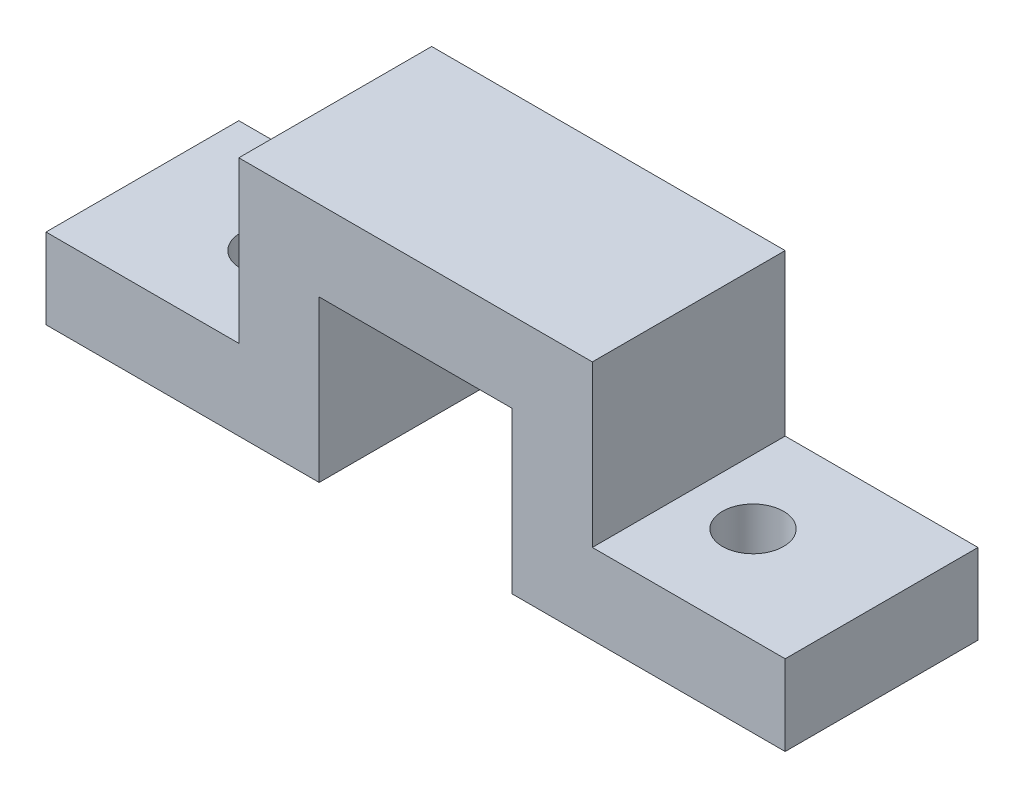
ISO-10303-21;
HEADER;
FILE_DESCRIPTION(('STEP AP214'),'2;1');
FILE_NAME('part.step','',(''),(''),'','','');
FILE_SCHEMA(('AUTOMOTIVE_DESIGN { 1 0 10303 214 1 1 1 1 }'));
ENDSEC;
DATA;
#1=APPLICATION_CONTEXT('core data for automotive mechanical design processes');
#2=APPLICATION_PROTOCOL_DEFINITION('international standard','automotive_design',2000,#1);
#3=PRODUCT_CONTEXT('',#1,'mechanical');
#4=PRODUCT('Part','Part','',(#3));
#5=PRODUCT_RELATED_PRODUCT_CATEGORY('part','',(#4));
#6=PRODUCT_DEFINITION_FORMATION('','',#4);
#7=PRODUCT_DEFINITION_CONTEXT('part definition',#1,'design');
#8=PRODUCT_DEFINITION('design','',#6,#7);
#9=PRODUCT_DEFINITION_SHAPE('','',#8);
#10=(LENGTH_UNIT() NAMED_UNIT(*) SI_UNIT(.MILLI.,.METRE.));
#11=(NAMED_UNIT(*) PLANE_ANGLE_UNIT() SI_UNIT($,.RADIAN.));
#12=(NAMED_UNIT(*) SI_UNIT($,.STERADIAN.) SOLID_ANGLE_UNIT());
#13=UNCERTAINTY_MEASURE_WITH_UNIT(LENGTH_MEASURE(1.E-05),#10,'distance_accuracy_value','');
#14=(GEOMETRIC_REPRESENTATION_CONTEXT(3) GLOBAL_UNCERTAINTY_ASSIGNED_CONTEXT((#13)) GLOBAL_UNIT_ASSIGNED_CONTEXT((#10,
#11,#12)) REPRESENTATION_CONTEXT('',''));
#15=CARTESIAN_POINT('',(0.,0.,0.));
#16=DIRECTION('',(0.,0.,1.));
#17=DIRECTION('',(1.,0.,0.));
#18=AXIS2_PLACEMENT_3D('',#15,#16,#17);
#19=CARTESIAN_POINT('',(-11.,5.,12.));
#20=DIRECTION('',(0.,-1.,0.));
#21=DIRECTION('',(1.,0.,0.));
#22=AXIS2_PLACEMENT_3D('',#19,#20,#21);
#23=PLANE('',#22);
#24=DIRECTION('',(-1.,0.,0.));
#25=VECTOR('',#24,1.);
#26=CARTESIAN_POINT('',(-11.,5.,0.));
#27=LINE('',#26,#25);
#28=CARTESIAN_POINT('',(-11.,5.,0.));
#29=VERTEX_POINT('',#28);
#30=CARTESIAN_POINT('',(-23.,5.,0.));
#31=VERTEX_POINT('',#30);
#32=EDGE_CURVE('E162',#29,#31,#27,.T.);
#33=ORIENTED_EDGE('',*,*,#32,.T.);
#34=DIRECTION('',(0.,0.,-1.));
#35=VECTOR('',#34,1.);
#36=CARTESIAN_POINT('',(-23.,5.,12.));
#37=LINE('',#36,#35);
#38=CARTESIAN_POINT('',(-23.,5.,12.));
#39=VERTEX_POINT('',#38);
#40=EDGE_CURVE('E193',#39,#31,#37,.T.);
#41=ORIENTED_EDGE('',*,*,#40,.F.);
#42=DIRECTION('',(-1.,0.,0.));
#43=VECTOR('',#42,1.);
#44=CARTESIAN_POINT('',(-11.,5.,12.));
#45=LINE('',#44,#43);
#46=CARTESIAN_POINT('',(-11.,5.,12.));
#47=VERTEX_POINT('',#46);
#48=EDGE_CURVE('E223',#47,#39,#45,.T.);
#49=ORIENTED_EDGE('',*,*,#48,.F.);
#50=DIRECTION('',(0.,0.,-1.));
#51=VECTOR('',#50,1.);
#52=CARTESIAN_POINT('',(-11.,5.,12.));
#53=LINE('',#52,#51);
#54=EDGE_CURVE('E196',#47,#29,#53,.T.);
#55=ORIENTED_EDGE('',*,*,#54,.T.);
#56=EDGE_LOOP('',(#33,#41,#49,#55));
#57=FACE_BOUND('',#56,.T.);
#58=CARTESIAN_POINT('',(-15.,5.,6.00000000000001));
#59=DIRECTION('',(0.,-1.,0.));
#60=DIRECTION('',(1.,0.,0.));
#61=AXIS2_PLACEMENT_3D('',#58,#59,#60);
#62=CIRCLE('',#61,1.9);
#63=CARTESIAN_POINT('',(-13.1,5.,6.00000000000001));
#64=VERTEX_POINT('',#63);
#65=EDGE_CURVE('E158',#64,#64,#62,.F.);
#66=ORIENTED_EDGE('',*,*,#65,.F.);
#67=EDGE_LOOP('',(#66));
#68=FACE_BOUND('',#67,.T.);
#69=ADVANCED_FACE('F32',(#57,#68),#23,.F.);
#70=CARTESIAN_POINT('',(-23.,0.,12.));
#71=DIRECTION('',(0.,1.,0.));
#72=DIRECTION('',(-1.,0.,0.));
#73=AXIS2_PLACEMENT_3D('',#70,#71,#72);
#74=PLANE('',#73);
#75=DIRECTION('',(1.,0.,0.));
#76=VECTOR('',#75,1.);
#77=CARTESIAN_POINT('',(-23.,0.,0.));
#78=LINE('',#77,#76);
#79=CARTESIAN_POINT('',(-23.,0.,0.));
#80=VERTEX_POINT('',#79);
#81=CARTESIAN_POINT('',(-6.,0.,0.));
#82=VERTEX_POINT('',#81);
#83=EDGE_CURVE('E166',#80,#82,#78,.T.);
#84=ORIENTED_EDGE('',*,*,#83,.T.);
#85=DIRECTION('',(0.,0.,-1.));
#86=VECTOR('',#85,1.);
#87=CARTESIAN_POINT('',(-6.,0.,12.));
#88=LINE('',#87,#86);
#89=CARTESIAN_POINT('',(-6.,0.,12.));
#90=VERTEX_POINT('',#89);
#91=EDGE_CURVE('E187',#90,#82,#88,.T.);
#92=ORIENTED_EDGE('',*,*,#91,.F.);
#93=DIRECTION('',(1.,0.,0.));
#94=VECTOR('',#93,1.);
#95=CARTESIAN_POINT('',(-23.,0.,12.));
#96=LINE('',#95,#94);
#97=CARTESIAN_POINT('',(-23.,0.,12.));
#98=VERTEX_POINT('',#97);
#99=EDGE_CURVE('E222',#98,#90,#96,.T.);
#100=ORIENTED_EDGE('',*,*,#99,.F.);
#101=DIRECTION('',(0.,0.,-1.));
#102=VECTOR('',#101,1.);
#103=CARTESIAN_POINT('',(-23.,0.,12.));
#104=LINE('',#103,#102);
#105=EDGE_CURVE('E190',#98,#80,#104,.T.);
#106=ORIENTED_EDGE('',*,*,#105,.T.);
#107=EDGE_LOOP('',(#84,#92,#100,#106));
#108=FACE_BOUND('',#107,.T.);
#109=CARTESIAN_POINT('',(-15.,0.,6.00000000000001));
#110=DIRECTION('',(0.,1.,0.));
#111=DIRECTION('',(0.,0.,1.));
#112=AXIS2_PLACEMENT_3D('',#109,#110,#111);
#113=CIRCLE('',#112,1.9);
#114=CARTESIAN_POINT('',(-15.,0.,7.90000000000001));
#115=VERTEX_POINT('',#114);
#116=EDGE_CURVE('E387',#115,#115,#113,.T.);
#117=ORIENTED_EDGE('',*,*,#116,.T.);
#118=EDGE_LOOP('',(#117));
#119=FACE_BOUND('',#118,.T.);
#120=ADVANCED_FACE('F258',(#108,#119),#74,.F.);
#121=CARTESIAN_POINT('',(11.,15.,12.));
#122=DIRECTION('',(-1.,0.,0.));
#123=DIRECTION('',(0.,-1.,0.));
#124=AXIS2_PLACEMENT_3D('',#121,#122,#123);
#125=PLANE('',#124);
#126=DIRECTION('',(0.,1.,0.));
#127=VECTOR('',#126,1.);
#128=CARTESIAN_POINT('',(11.,15.,0.));
#129=LINE('',#128,#127);
#130=CARTESIAN_POINT('',(11.,5.,0.));
#131=VERTEX_POINT('',#130);
#132=CARTESIAN_POINT('',(11.,15.,0.));
#133=VERTEX_POINT('',#132);
#134=EDGE_CURVE('E154',#131,#133,#129,.T.);
#135=ORIENTED_EDGE('',*,*,#134,.T.);
#136=DIRECTION('',(0.,0.,-1.));
#137=VECTOR('',#136,1.);
#138=CARTESIAN_POINT('',(11.,15.,12.));
#139=LINE('',#138,#137);
#140=CARTESIAN_POINT('',(11.,15.,12.));
#141=VERTEX_POINT('',#140);
#142=EDGE_CURVE('E11',#141,#133,#139,.T.);
#143=ORIENTED_EDGE('',*,*,#142,.F.);
#144=DIRECTION('',(0.,1.,0.));
#145=VECTOR('',#144,1.);
#146=CARTESIAN_POINT('',(11.,15.,12.));
#147=LINE('',#146,#145);
#148=CARTESIAN_POINT('',(11.,5.,12.));
#149=VERTEX_POINT('',#148);
#150=EDGE_CURVE('E177',#149,#141,#147,.T.);
#151=ORIENTED_EDGE('',*,*,#150,.F.);
#152=DIRECTION('',(0.,0.,-1.));
#153=VECTOR('',#152,1.);
#154=CARTESIAN_POINT('',(11.,5.,12.));
#155=LINE('',#154,#153);
#156=EDGE_CURVE('E150',#149,#131,#155,.T.);
#157=ORIENTED_EDGE('',*,*,#156,.T.);
#158=EDGE_LOOP('',(#135,#143,#151,#157));
#159=FACE_BOUND('',#158,.T.);
#160=ADVANCED_FACE('F34',(#159),#125,.F.);
#161=CARTESIAN_POINT('',(-11.,15.,12.));
#162=DIRECTION('',(0.,-1.,0.));
#163=DIRECTION('',(0.,0.,-1.));
#164=AXIS2_PLACEMENT_3D('',#161,#162,#163);
#165=PLANE('',#164);
#166=DIRECTION('',(-1.,0.,0.));
#167=VECTOR('',#166,1.);
#168=CARTESIAN_POINT('',(-11.,15.,0.));
#169=LINE('',#168,#167);
#170=CARTESIAN_POINT('',(-11.,15.,0.));
#171=VERTEX_POINT('',#170);
#172=EDGE_CURVE('E157',#133,#171,#169,.T.);
#173=ORIENTED_EDGE('',*,*,#172,.T.);
#174=DIRECTION('',(0.,0.,-1.));
#175=VECTOR('',#174,1.);
#176=CARTESIAN_POINT('',(-11.,15.,12.));
#177=LINE('',#176,#175);
#178=CARTESIAN_POINT('',(-11.,15.,12.));
#179=VERTEX_POINT('',#178);
#180=EDGE_CURVE('E42',#179,#171,#177,.T.);
#181=ORIENTED_EDGE('',*,*,#180,.F.);
#182=DIRECTION('',(-1.,0.,0.));
#183=VECTOR('',#182,1.);
#184=CARTESIAN_POINT('',(-11.,15.,12.));
#185=LINE('',#184,#183);
#186=EDGE_CURVE('E105',#141,#179,#185,.T.);
#187=ORIENTED_EDGE('',*,*,#186,.F.);
#188=ORIENTED_EDGE('',*,*,#142,.T.);
#189=EDGE_LOOP('',(#173,#181,#187,#188));
#190=FACE_BOUND('',#189,.T.);
#191=ADVANCED_FACE('F268',(#190),#165,.F.);
#192=CARTESIAN_POINT('',(-11.,15.,12.));
#193=DIRECTION('',(1.,0.,0.));
#194=DIRECTION('',(0.,1.,0.));
#195=AXIS2_PLACEMENT_3D('',#192,#193,#194);
#196=PLANE('',#195);
#197=DIRECTION('',(0.,-1.,0.));
#198=VECTOR('',#197,1.);
#199=CARTESIAN_POINT('',(-11.,15.,0.));
#200=LINE('',#199,#198);
#201=EDGE_CURVE('E160',#171,#29,#200,.T.);
#202=ORIENTED_EDGE('',*,*,#201,.T.);
#203=ORIENTED_EDGE('',*,*,#54,.F.);
#204=DIRECTION('',(0.,-1.,0.));
#205=VECTOR('',#204,1.);
#206=CARTESIAN_POINT('',(-11.,15.,12.));
#207=LINE('',#206,#205);
#208=EDGE_CURVE('E205',#179,#47,#207,.T.);
#209=ORIENTED_EDGE('',*,*,#208,.F.);
#210=ORIENTED_EDGE('',*,*,#180,.T.);
#211=EDGE_LOOP('',(#202,#203,#209,#210));
#212=FACE_BOUND('',#211,.T.);
#213=ADVANCED_FACE('F203',(#212),#196,.F.);
#214=CARTESIAN_POINT('',(-23.,5.,12.));
#215=DIRECTION('',(1.,0.,0.));
#216=DIRECTION('',(0.,0.,-1.));
#217=AXIS2_PLACEMENT_3D('',#214,#215,#216);
#218=PLANE('',#217);
#219=DIRECTION('',(0.,-1.,0.));
#220=VECTOR('',#219,1.);
#221=CARTESIAN_POINT('',(-23.,5.,0.));
#222=LINE('',#221,#220);
#223=EDGE_CURVE('E164',#31,#80,#222,.T.);
#224=ORIENTED_EDGE('',*,*,#223,.T.);
#225=ORIENTED_EDGE('',*,*,#105,.F.);
#226=DIRECTION('',(0.,-1.,0.));
#227=VECTOR('',#226,1.);
#228=CARTESIAN_POINT('',(-23.,5.,12.));
#229=LINE('',#228,#227);
#230=EDGE_CURVE('E220',#39,#98,#229,.T.);
#231=ORIENTED_EDGE('',*,*,#230,.F.);
#232=ORIENTED_EDGE('',*,*,#40,.T.);
#233=EDGE_LOOP('',(#224,#225,#231,#232));
#234=FACE_BOUND('',#233,.T.);
#235=ADVANCED_FACE('F218',(#234),#218,.F.);
#236=CARTESIAN_POINT('',(-6.,0.,12.));
#237=DIRECTION('',(-1.,0.,0.));
#238=DIRECTION('',(0.,-1.,0.));
#239=AXIS2_PLACEMENT_3D('',#236,#237,#238);
#240=PLANE('',#239);
#241=DIRECTION('',(0.,1.,0.));
#242=VECTOR('',#241,1.);
#243=CARTESIAN_POINT('',(-6.,0.,0.));
#244=LINE('',#243,#242);
#245=CARTESIAN_POINT('',(-6.,10.,0.));
#246=VERTEX_POINT('',#245);
#247=EDGE_CURVE('E168',#82,#246,#244,.T.);
#248=ORIENTED_EDGE('',*,*,#247,.T.);
#249=DIRECTION('',(0.,0.,-1.));
#250=VECTOR('',#249,1.);
#251=CARTESIAN_POINT('',(-6.,10.,12.));
#252=LINE('',#251,#250);
#253=CARTESIAN_POINT('',(-6.,10.,12.));
#254=VERTEX_POINT('',#253);
#255=EDGE_CURVE('E184',#254,#246,#252,.T.);
#256=ORIENTED_EDGE('',*,*,#255,.F.);
#257=DIRECTION('',(0.,1.,0.));
#258=VECTOR('',#257,1.);
#259=CARTESIAN_POINT('',(-6.,0.,12.));
#260=LINE('',#259,#258);
#261=EDGE_CURVE('E225',#90,#254,#260,.T.);
#262=ORIENTED_EDGE('',*,*,#261,.F.);
#263=ORIENTED_EDGE('',*,*,#91,.T.);
#264=EDGE_LOOP('',(#248,#256,#262,#263));
#265=FACE_BOUND('',#264,.T.);
#266=ADVANCED_FACE('F350',(#265),#240,.F.);
#267=CARTESIAN_POINT('',(6.,10.,12.));
#268=DIRECTION('',(0.,1.,0.));
#269=DIRECTION('',(0.,0.,1.));
#270=AXIS2_PLACEMENT_3D('',#267,#268,#269);
#271=PLANE('',#270);
#272=DIRECTION('',(1.,0.,0.));
#273=VECTOR('',#272,1.);
#274=CARTESIAN_POINT('',(6.,10.,0.));
#275=LINE('',#274,#273);
#276=CARTESIAN_POINT('',(6.,10.,0.));
#277=VERTEX_POINT('',#276);
#278=EDGE_CURVE('E170',#246,#277,#275,.T.);
#279=ORIENTED_EDGE('',*,*,#278,.T.);
#280=DIRECTION('',(0.,0.,-1.));
#281=VECTOR('',#280,1.);
#282=CARTESIAN_POINT('',(6.,10.,12.));
#283=LINE('',#282,#281);
#284=CARTESIAN_POINT('',(6.,10.,12.));
#285=VERTEX_POINT('',#284);
#286=EDGE_CURVE('E181',#285,#277,#283,.T.);
#287=ORIENTED_EDGE('',*,*,#286,.F.);
#288=DIRECTION('',(1.,0.,0.));
#289=VECTOR('',#288,1.);
#290=CARTESIAN_POINT('',(6.,10.,12.));
#291=LINE('',#290,#289);
#292=EDGE_CURVE('E231',#254,#285,#291,.T.);
#293=ORIENTED_EDGE('',*,*,#292,.F.);
#294=ORIENTED_EDGE('',*,*,#255,.T.);
#295=EDGE_LOOP('',(#279,#287,#293,#294));
#296=FACE_BOUND('',#295,.T.);
#297=ADVANCED_FACE('F237',(#296),#271,.F.);
#298=CARTESIAN_POINT('',(6.,0.,12.));
#299=DIRECTION('',(1.,0.,0.));
#300=DIRECTION('',(0.,1.,0.));
#301=AXIS2_PLACEMENT_3D('',#298,#299,#300);
#302=PLANE('',#301);
#303=DIRECTION('',(0.,-1.,0.));
#304=VECTOR('',#303,1.);
#305=CARTESIAN_POINT('',(6.,0.,0.));
#306=LINE('',#305,#304);
#307=CARTESIAN_POINT('',(6.,0.,0.));
#308=VERTEX_POINT('',#307);
#309=EDGE_CURVE('E172',#277,#308,#306,.T.);
#310=ORIENTED_EDGE('',*,*,#309,.T.);
#311=DIRECTION('',(0.,0.,-1.));
#312=VECTOR('',#311,1.);
#313=CARTESIAN_POINT('',(6.,0.,12.));
#314=LINE('',#313,#312);
#315=CARTESIAN_POINT('',(6.,0.,12.));
#316=VERTEX_POINT('',#315);
#317=EDGE_CURVE('E145',#316,#308,#314,.T.);
#318=ORIENTED_EDGE('',*,*,#317,.F.);
#319=DIRECTION('',(0.,-1.,0.));
#320=VECTOR('',#319,1.);
#321=CARTESIAN_POINT('',(6.,0.,12.));
#322=LINE('',#321,#320);
#323=EDGE_CURVE('E136',#285,#316,#322,.T.);
#324=ORIENTED_EDGE('',*,*,#323,.F.);
#325=ORIENTED_EDGE('',*,*,#286,.T.);
#326=EDGE_LOOP('',(#310,#318,#324,#325));
#327=FACE_BOUND('',#326,.T.);
#328=ADVANCED_FACE('F241',(#327),#302,.F.);
#329=CARTESIAN_POINT('',(23.,0.,12.));
#330=DIRECTION('',(0.,1.,0.));
#331=DIRECTION('',(-1.,0.,0.));
#332=AXIS2_PLACEMENT_3D('',#329,#330,#331);
#333=PLANE('',#332);
#334=CARTESIAN_POINT('',(15.,0.,6.00000000000001));
#335=DIRECTION('',(0.,-1.,0.));
#336=DIRECTION('',(0.,0.,-1.));
#337=AXIS2_PLACEMENT_3D('',#334,#335,#336);
#338=CIRCLE('',#337,1.9);
#339=CARTESIAN_POINT('',(15.,0.,4.10000000000001));
#340=VERTEX_POINT('',#339);
#341=EDGE_CURVE('E391',#340,#340,#338,.T.);
#342=ORIENTED_EDGE('',*,*,#341,.F.);
#343=EDGE_LOOP('',(#342));
#344=FACE_BOUND('',#343,.T.);
#345=DIRECTION('',(1.,0.,0.));
#346=VECTOR('',#345,1.);
#347=CARTESIAN_POINT('',(23.,0.,0.));
#348=LINE('',#347,#346);
#349=CARTESIAN_POINT('',(23.,0.,0.));
#350=VERTEX_POINT('',#349);
#351=EDGE_CURVE('E144',#308,#350,#348,.T.);
#352=ORIENTED_EDGE('',*,*,#351,.T.);
#353=DIRECTION('',(0.,0.,-1.));
#354=VECTOR('',#353,1.);
#355=CARTESIAN_POINT('',(23.,0.,12.));
#356=LINE('',#355,#354);
#357=CARTESIAN_POINT('',(23.,0.,12.));
#358=VERTEX_POINT('',#357);
#359=EDGE_CURVE('E141',#358,#350,#356,.T.);
#360=ORIENTED_EDGE('',*,*,#359,.F.);
#361=DIRECTION('',(1.,0.,0.));
#362=VECTOR('',#361,1.);
#363=CARTESIAN_POINT('',(23.,0.,12.));
#364=LINE('',#363,#362);
#365=EDGE_CURVE('E130',#316,#358,#364,.T.);
#366=ORIENTED_EDGE('',*,*,#365,.F.);
#367=ORIENTED_EDGE('',*,*,#317,.T.);
#368=EDGE_LOOP('',(#352,#360,#366,#367));
#369=FACE_BOUND('',#368,.T.);
#370=ADVANCED_FACE('F142',(#344,#369),#333,.F.);
#371=CARTESIAN_POINT('',(23.,5.,12.));
#372=DIRECTION('',(-1.,0.,0.));
#373=DIRECTION('',(0.,0.,1.));
#374=AXIS2_PLACEMENT_3D('',#371,#372,#373);
#375=PLANE('',#374);
#376=DIRECTION('',(0.,1.,0.));
#377=VECTOR('',#376,1.);
#378=CARTESIAN_POINT('',(23.,5.,0.));
#379=LINE('',#378,#377);
#380=CARTESIAN_POINT('',(23.,5.,0.));
#381=VERTEX_POINT('',#380);
#382=EDGE_CURVE('E91',#350,#381,#379,.T.);
#383=ORIENTED_EDGE('',*,*,#382,.T.);
#384=DIRECTION('',(0.,0.,-1.));
#385=VECTOR('',#384,1.);
#386=CARTESIAN_POINT('',(23.,5.,12.));
#387=LINE('',#386,#385);
#388=CARTESIAN_POINT('',(23.,5.,12.));
#389=VERTEX_POINT('',#388);
#390=EDGE_CURVE('E146',#389,#381,#387,.T.);
#391=ORIENTED_EDGE('',*,*,#390,.F.);
#392=DIRECTION('',(0.,1.,0.));
#393=VECTOR('',#392,1.);
#394=CARTESIAN_POINT('',(23.,5.,12.));
#395=LINE('',#394,#393);
#396=EDGE_CURVE('E134',#358,#389,#395,.T.);
#397=ORIENTED_EDGE('',*,*,#396,.F.);
#398=ORIENTED_EDGE('',*,*,#359,.T.);
#399=EDGE_LOOP('',(#383,#391,#397,#398));
#400=FACE_BOUND('',#399,.T.);
#401=ADVANCED_FACE('F148',(#400),#375,.F.);
#402=CARTESIAN_POINT('',(11.,5.,12.));
#403=DIRECTION('',(0.,-1.,0.));
#404=DIRECTION('',(1.,0.,0.));
#405=AXIS2_PLACEMENT_3D('',#402,#403,#404);
#406=PLANE('',#405);
#407=CARTESIAN_POINT('',(15.,5.,6.00000000000001));
#408=DIRECTION('',(0.,-1.,0.));
#409=DIRECTION('',(1.,0.,0.));
#410=AXIS2_PLACEMENT_3D('',#407,#408,#409);
#411=CIRCLE('',#410,1.9);
#412=CARTESIAN_POINT('',(16.9,5.,6.00000000000001));
#413=VERTEX_POINT('',#412);
#414=EDGE_CURVE('E36',#413,#413,#411,.T.);
#415=ORIENTED_EDGE('',*,*,#414,.T.);
#416=EDGE_LOOP('',(#415));
#417=FACE_BOUND('',#416,.T.);
#418=DIRECTION('',(-1.,0.,0.));
#419=VECTOR('',#418,1.);
#420=CARTESIAN_POINT('',(11.,5.,0.));
#421=LINE('',#420,#419);
#422=EDGE_CURVE('E97',#381,#131,#421,.T.);
#423=ORIENTED_EDGE('',*,*,#422,.T.);
#424=ORIENTED_EDGE('',*,*,#156,.F.);
#425=DIRECTION('',(-1.,0.,0.));
#426=VECTOR('',#425,1.);
#427=CARTESIAN_POINT('',(11.,5.,12.));
#428=LINE('',#427,#426);
#429=EDGE_CURVE('E50',#389,#149,#428,.T.);
#430=ORIENTED_EDGE('',*,*,#429,.F.);
#431=ORIENTED_EDGE('',*,*,#390,.T.);
#432=EDGE_LOOP('',(#423,#424,#430,#431));
#433=FACE_BOUND('',#432,.T.);
#434=ADVANCED_FACE('F245',(#417,#433),#406,.F.);
#435=CARTESIAN_POINT('',(0.,0.,12.));
#436=DIRECTION('',(0.,0.,1.));
#437=DIRECTION('',(1.,0.,0.));
#438=AXIS2_PLACEMENT_3D('',#435,#436,#437);
#439=PLANE('',#438);
#440=ORIENTED_EDGE('',*,*,#150,.T.);
#441=ORIENTED_EDGE('',*,*,#186,.T.);
#442=ORIENTED_EDGE('',*,*,#208,.T.);
#443=ORIENTED_EDGE('',*,*,#48,.T.);
#444=ORIENTED_EDGE('',*,*,#230,.T.);
#445=ORIENTED_EDGE('',*,*,#99,.T.);
#446=ORIENTED_EDGE('',*,*,#261,.T.);
#447=ORIENTED_EDGE('',*,*,#292,.T.);
#448=ORIENTED_EDGE('',*,*,#323,.T.);
#449=ORIENTED_EDGE('',*,*,#365,.T.);
#450=ORIENTED_EDGE('',*,*,#396,.T.);
#451=ORIENTED_EDGE('',*,*,#429,.T.);
#452=EDGE_LOOP('',(#440,#441,#442,#443,#444,#445,#446,#447,#448,#449,#450,#451));
#453=FACE_BOUND('',#452,.T.);
#454=ADVANCED_FACE('F132',(#453),#439,.T.);
#455=CARTESIAN_POINT('',(0.,0.,0.));
#456=DIRECTION('',(0.,0.,1.));
#457=DIRECTION('',(1.,0.,0.));
#458=AXIS2_PLACEMENT_3D('',#455,#456,#457);
#459=PLANE('',#458);
#460=ORIENTED_EDGE('',*,*,#134,.F.);
#461=ORIENTED_EDGE('',*,*,#422,.F.);
#462=ORIENTED_EDGE('',*,*,#382,.F.);
#463=ORIENTED_EDGE('',*,*,#351,.F.);
#464=ORIENTED_EDGE('',*,*,#309,.F.);
#465=ORIENTED_EDGE('',*,*,#278,.F.);
#466=ORIENTED_EDGE('',*,*,#247,.F.);
#467=ORIENTED_EDGE('',*,*,#83,.F.);
#468=ORIENTED_EDGE('',*,*,#223,.F.);
#469=ORIENTED_EDGE('',*,*,#32,.F.);
#470=ORIENTED_EDGE('',*,*,#201,.F.);
#471=ORIENTED_EDGE('',*,*,#172,.F.);
#472=EDGE_LOOP('',(#460,#461,#462,#463,#464,#465,#466,#467,#468,#469,#470,#471));
#473=FACE_BOUND('',#472,.T.);
#474=ADVANCED_FACE('F209',(#473),#459,.F.);
#475=CARTESIAN_POINT('',(-15.,15.,6.00000000000001));
#476=DIRECTION('',(0.,-1.,0.));
#477=DIRECTION('',(0.,0.,-1.));
#478=AXIS2_PLACEMENT_3D('',#475,#476,#477);
#479=CYLINDRICAL_SURFACE('',#478,1.9);
#480=ORIENTED_EDGE('',*,*,#116,.F.);
#481=EDGE_LOOP('',(#480));
#482=FACE_BOUND('',#481,.T.);
#483=ORIENTED_EDGE('',*,*,#65,.T.);
#484=EDGE_LOOP('',(#483));
#485=FACE_BOUND('',#484,.T.);
#486=ADVANCED_FACE('F305',(#482,#485),#479,.F.);
#487=CARTESIAN_POINT('',(15.,15.,6.00000000000001));
#488=DIRECTION('',(0.,-1.,0.));
#489=DIRECTION('',(0.,0.,-1.));
#490=AXIS2_PLACEMENT_3D('',#487,#488,#489);
#491=CYLINDRICAL_SURFACE('',#490,1.9);
#492=ORIENTED_EDGE('',*,*,#341,.T.);
#493=EDGE_LOOP('',(#492));
#494=FACE_BOUND('',#493,.T.);
#495=ORIENTED_EDGE('',*,*,#414,.F.);
#496=EDGE_LOOP('',(#495));
#497=FACE_BOUND('',#496,.T.);
#498=ADVANCED_FACE('F310',(#494,#497),#491,.F.);
#499=CLOSED_SHELL('',(#69,#120,#160,#191,#213,#235,#266,#297,#328,#370,#401,#434,#454,#474,#486,#498));
#500=MANIFOLD_SOLID_BREP('B2',#499);
#501=ADVANCED_BREP_SHAPE_REPRESENTATION('',(#18,#500),#14);
#502=SHAPE_DEFINITION_REPRESENTATION(#9,#501);
ENDSEC;
END-ISO-10303-21;
